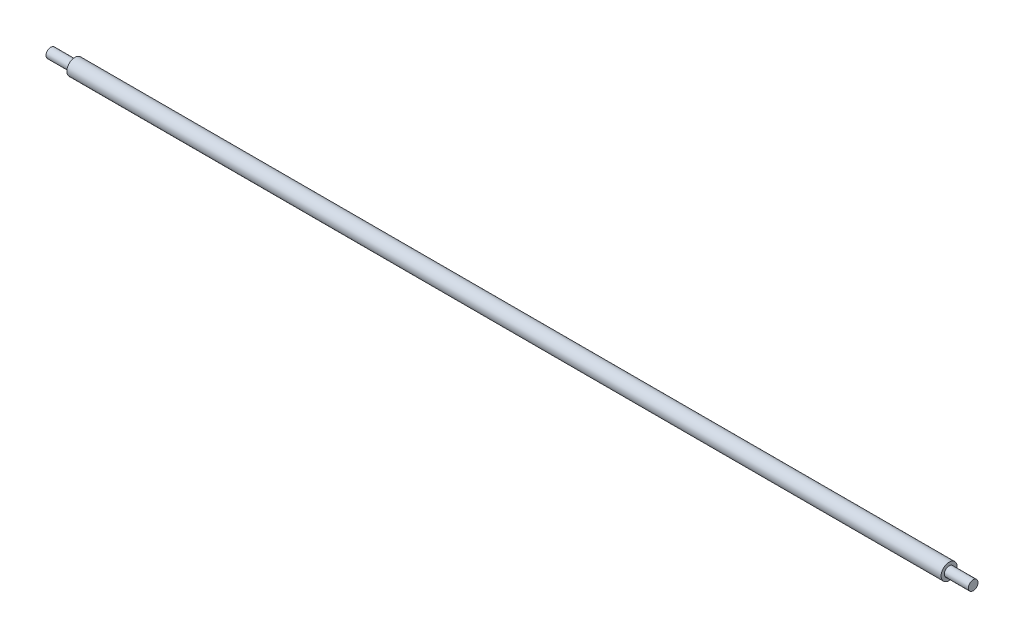
ISO-10303-21;
HEADER;
FILE_DESCRIPTION(('STEP AP214'),'2;1');
FILE_NAME('part.step','',(''),(''),'','','');
FILE_SCHEMA(('AUTOMOTIVE_DESIGN { 1 0 10303 214 1 1 1 1 }'));
ENDSEC;
DATA;
#1=APPLICATION_CONTEXT('core data for automotive mechanical design processes');
#2=APPLICATION_PROTOCOL_DEFINITION('international standard','automotive_design',2000,#1);
#3=PRODUCT_CONTEXT('',#1,'mechanical');
#4=PRODUCT('Part','Part','',(#3));
#5=PRODUCT_RELATED_PRODUCT_CATEGORY('part','',(#4));
#6=PRODUCT_DEFINITION_FORMATION('','',#4);
#7=PRODUCT_DEFINITION_CONTEXT('part definition',#1,'design');
#8=PRODUCT_DEFINITION('design','',#6,#7);
#9=PRODUCT_DEFINITION_SHAPE('','',#8);
#10=(LENGTH_UNIT() NAMED_UNIT(*) SI_UNIT(.MILLI.,.METRE.));
#11=(NAMED_UNIT(*) PLANE_ANGLE_UNIT() SI_UNIT($,.RADIAN.));
#12=(NAMED_UNIT(*) SI_UNIT($,.STERADIAN.) SOLID_ANGLE_UNIT());
#13=UNCERTAINTY_MEASURE_WITH_UNIT(LENGTH_MEASURE(1.E-05),#10,'distance_accuracy_value','');
#14=(GEOMETRIC_REPRESENTATION_CONTEXT(3) GLOBAL_UNCERTAINTY_ASSIGNED_CONTEXT((#13)) GLOBAL_UNIT_ASSIGNED_CONTEXT((#10,
#11,#12)) REPRESENTATION_CONTEXT('',''));
#15=CARTESIAN_POINT('',(0.,0.,0.));
#16=DIRECTION('',(0.,0.,1.));
#17=DIRECTION('',(1.,0.,0.));
#18=AXIS2_PLACEMENT_3D('',#15,#16,#17);
#19=CARTESIAN_POINT('',(-270.,0.,0.));
#20=DIRECTION('',(1.,0.,0.));
#21=DIRECTION('',(0.,0.,-1.));
#22=AXIS2_PLACEMENT_3D('',#19,#20,#21);
#23=CYLINDRICAL_SURFACE('',#22,5.);
#24=CARTESIAN_POINT('',(-270.,0.,0.));
#25=DIRECTION('',(1.,0.,0.));
#26=DIRECTION('',(0.,0.,-1.));
#27=AXIS2_PLACEMENT_3D('',#24,#25,#26);
#28=CIRCLE('',#27,5.);
#29=CARTESIAN_POINT('',(-270.,0.,-5.));
#30=VERTEX_POINT('',#29);
#31=EDGE_CURVE('E39',#30,#30,#28,.T.);
#32=ORIENTED_EDGE('',*,*,#31,.T.);
#33=EDGE_LOOP('',(#32));
#34=FACE_BOUND('',#33,.T.);
#35=CARTESIAN_POINT('',(275.,0.,0.));
#36=DIRECTION('',(1.,0.,0.));
#37=DIRECTION('',(0.,0.,-1.));
#38=AXIS2_PLACEMENT_3D('',#35,#36,#37);
#39=CIRCLE('',#38,5.);
#40=CARTESIAN_POINT('',(275.,0.,-5.));
#41=VERTEX_POINT('',#40);
#42=EDGE_CURVE('E54',#41,#41,#39,.T.);
#43=ORIENTED_EDGE('',*,*,#42,.F.);
#44=EDGE_LOOP('',(#43));
#45=FACE_BOUND('',#44,.T.);
#46=ADVANCED_FACE('F36',(#34,#45),#23,.T.);
#47=CARTESIAN_POINT('',(-270.,0.,0.));
#48=DIRECTION('',(1.,0.,0.));
#49=DIRECTION('',(0.,0.,-1.));
#50=AXIS2_PLACEMENT_3D('',#47,#48,#49);
#51=PLANE('',#50);
#52=CARTESIAN_POINT('',(-270.,0.,0.));
#53=DIRECTION('',(-1.,0.,0.));
#54=DIRECTION('',(0.,0.,1.));
#55=AXIS2_PLACEMENT_3D('',#52,#53,#54);
#56=CIRCLE('',#55,3.);
#57=CARTESIAN_POINT('',(-270.,0.,3.));
#58=VERTEX_POINT('',#57);
#59=EDGE_CURVE('E43',#58,#58,#56,.T.);
#60=ORIENTED_EDGE('',*,*,#59,.F.);
#61=EDGE_LOOP('',(#60));
#62=FACE_BOUND('',#61,.T.);
#63=ORIENTED_EDGE('',*,*,#31,.F.);
#64=EDGE_LOOP('',(#63));
#65=FACE_BOUND('',#64,.T.);
#66=ADVANCED_FACE('F63',(#62,#65),#51,.F.);
#67=CARTESIAN_POINT('',(275.,0.,0.));
#68=DIRECTION('',(1.,0.,0.));
#69=DIRECTION('',(0.,0.,-1.));
#70=AXIS2_PLACEMENT_3D('',#67,#68,#69);
#71=PLANE('',#70);
#72=CARTESIAN_POINT('',(275.,0.,0.));
#73=DIRECTION('',(1.,0.,0.));
#74=DIRECTION('',(0.,0.,-1.));
#75=AXIS2_PLACEMENT_3D('',#72,#73,#74);
#76=CIRCLE('',#75,3.);
#77=CARTESIAN_POINT('',(275.,0.,-3.));
#78=VERTEX_POINT('',#77);
#79=EDGE_CURVE('E10',#78,#78,#76,.T.);
#80=ORIENTED_EDGE('',*,*,#79,.F.);
#81=EDGE_LOOP('',(#80));
#82=FACE_BOUND('',#81,.T.);
#83=ORIENTED_EDGE('',*,*,#42,.T.);
#84=EDGE_LOOP('',(#83));
#85=FACE_BOUND('',#84,.T.);
#86=ADVANCED_FACE('F65',(#82,#85),#71,.T.);
#87=CARTESIAN_POINT('',(-285.,0.,0.));
#88=DIRECTION('',(1.,0.,0.));
#89=DIRECTION('',(0.,0.,-1.));
#90=AXIS2_PLACEMENT_3D('',#87,#88,#89);
#91=CYLINDRICAL_SURFACE('',#90,3.);
#92=CARTESIAN_POINT('',(-285.,0.,0.));
#93=DIRECTION('',(-1.,0.,0.));
#94=DIRECTION('',(0.,0.,1.));
#95=AXIS2_PLACEMENT_3D('',#92,#93,#94);
#96=CIRCLE('',#95,3.);
#97=CARTESIAN_POINT('',(-285.,0.,3.));
#98=VERTEX_POINT('',#97);
#99=EDGE_CURVE('E52',#98,#98,#96,.T.);
#100=ORIENTED_EDGE('',*,*,#99,.F.);
#101=EDGE_LOOP('',(#100));
#102=FACE_BOUND('',#101,.T.);
#103=ORIENTED_EDGE('',*,*,#59,.T.);
#104=EDGE_LOOP('',(#103));
#105=FACE_BOUND('',#104,.T.);
#106=ADVANCED_FACE('F71',(#102,#105),#91,.T.);
#107=CARTESIAN_POINT('',(-285.,0.,0.));
#108=DIRECTION('',(-1.,0.,0.));
#109=DIRECTION('',(0.,0.,1.));
#110=AXIS2_PLACEMENT_3D('',#107,#108,#109);
#111=PLANE('',#110);
#112=ORIENTED_EDGE('',*,*,#99,.T.);
#113=EDGE_LOOP('',(#112));
#114=FACE_BOUND('',#113,.T.);
#115=ADVANCED_FACE('F78',(#114),#111,.T.);
#116=CARTESIAN_POINT('',(290.,0.,0.));
#117=DIRECTION('',(-1.,0.,0.));
#118=DIRECTION('',(0.,0.,1.));
#119=AXIS2_PLACEMENT_3D('',#116,#117,#118);
#120=CYLINDRICAL_SURFACE('',#119,3.);
#121=CARTESIAN_POINT('',(290.,0.,0.));
#122=DIRECTION('',(1.,0.,0.));
#123=DIRECTION('',(0.,0.,-1.));
#124=AXIS2_PLACEMENT_3D('',#121,#122,#123);
#125=CIRCLE('',#124,3.);
#126=CARTESIAN_POINT('',(290.,0.,-3.));
#127=VERTEX_POINT('',#126);
#128=EDGE_CURVE('E51',#127,#127,#125,.T.);
#129=ORIENTED_EDGE('',*,*,#128,.F.);
#130=EDGE_LOOP('',(#129));
#131=FACE_BOUND('',#130,.T.);
#132=ORIENTED_EDGE('',*,*,#79,.T.);
#133=EDGE_LOOP('',(#132));
#134=FACE_BOUND('',#133,.T.);
#135=ADVANCED_FACE('F82',(#131,#134),#120,.T.);
#136=CARTESIAN_POINT('',(290.,0.,0.));
#137=DIRECTION('',(1.,0.,0.));
#138=DIRECTION('',(0.,0.,-1.));
#139=AXIS2_PLACEMENT_3D('',#136,#137,#138);
#140=PLANE('',#139);
#141=ORIENTED_EDGE('',*,*,#128,.T.);
#142=EDGE_LOOP('',(#141));
#143=FACE_BOUND('',#142,.T.);
#144=ADVANCED_FACE('F86',(#143),#140,.T.);
#145=CLOSED_SHELL('',(#46,#66,#86,#106,#115,#135,#144));
#146=MANIFOLD_SOLID_BREP('B2',#145);
#147=ADVANCED_BREP_SHAPE_REPRESENTATION('',(#18,#146),#14);
#148=SHAPE_DEFINITION_REPRESENTATION(#9,#147);
ENDSEC;
END-ISO-10303-21;
